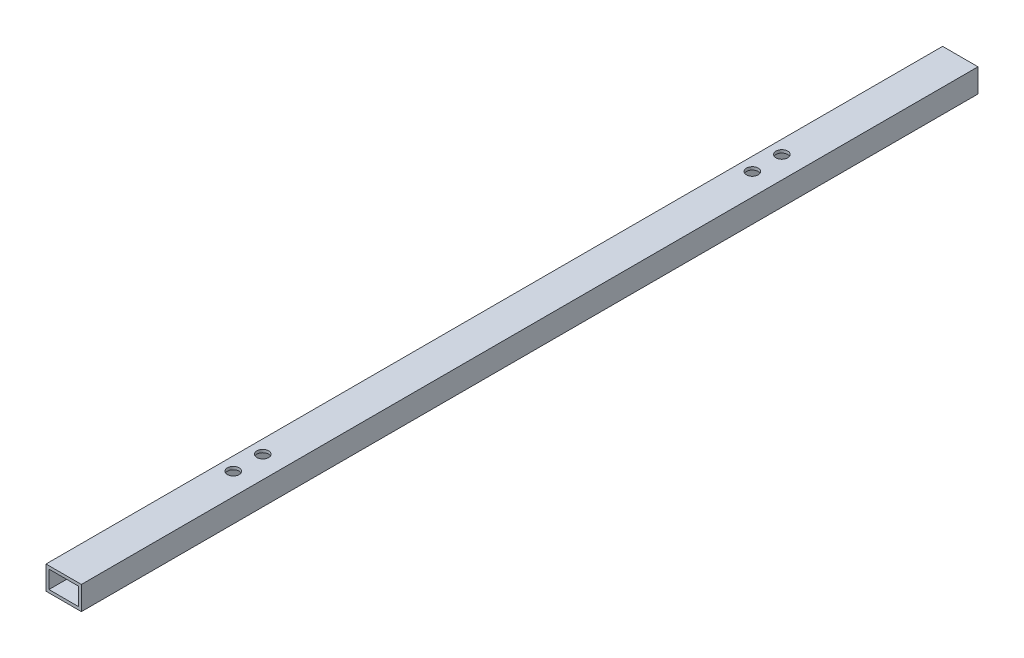
ISO-10303-21;
HEADER;
FILE_DESCRIPTION(('STEP AP214'),'2;1');
FILE_NAME('part.step','',(''),(''),'','','');
FILE_SCHEMA(('AUTOMOTIVE_DESIGN { 1 0 10303 214 1 1 1 1 }'));
ENDSEC;
DATA;
#1=APPLICATION_CONTEXT('core data for automotive mechanical design processes');
#2=APPLICATION_PROTOCOL_DEFINITION('international standard','automotive_design',2000,#1);
#3=PRODUCT_CONTEXT('',#1,'mechanical');
#4=PRODUCT('Part','Part','',(#3));
#5=PRODUCT_RELATED_PRODUCT_CATEGORY('part','',(#4));
#6=PRODUCT_DEFINITION_FORMATION('','',#4);
#7=PRODUCT_DEFINITION_CONTEXT('part definition',#1,'design');
#8=PRODUCT_DEFINITION('design','',#6,#7);
#9=PRODUCT_DEFINITION_SHAPE('','',#8);
#10=(LENGTH_UNIT() NAMED_UNIT(*) SI_UNIT(.MILLI.,.METRE.));
#11=(NAMED_UNIT(*) PLANE_ANGLE_UNIT() SI_UNIT($,.RADIAN.));
#12=(NAMED_UNIT(*) SI_UNIT($,.STERADIAN.) SOLID_ANGLE_UNIT());
#13=UNCERTAINTY_MEASURE_WITH_UNIT(LENGTH_MEASURE(1.E-05),#10,'distance_accuracy_value','');
#14=(GEOMETRIC_REPRESENTATION_CONTEXT(3) GLOBAL_UNCERTAINTY_ASSIGNED_CONTEXT((#13)) GLOBAL_UNIT_ASSIGNED_CONTEXT((#10,
#11,#12)) REPRESENTATION_CONTEXT('',''));
#15=CARTESIAN_POINT('',(0.,0.,0.));
#16=DIRECTION('',(0.,0.,1.));
#17=DIRECTION('',(1.,0.,0.));
#18=AXIS2_PLACEMENT_3D('',#15,#16,#17);
#19=CARTESIAN_POINT('',(19.05,-12.7,482.6));
#20=DIRECTION('',(0.,1.,0.));
#21=DIRECTION('',(0.,0.,1.));
#22=AXIS2_PLACEMENT_3D('',#19,#20,#21);
#23=PLANE('',#22);
#24=CARTESIAN_POINT('',(-4.7625,-12.7,-295.275));
#25=DIRECTION('',(0.,1.,0.));
#26=DIRECTION('',(0.,0.,1.));
#27=AXIS2_PLACEMENT_3D('',#24,#25,#26);
#28=CIRCLE('',#27,6.35);
#29=CARTESIAN_POINT('',(-4.7625,-12.7,-288.925));
#30=VERTEX_POINT('',#29);
#31=EDGE_CURVE('E239',#30,#30,#28,.T.);
#32=ORIENTED_EDGE('',*,*,#31,.T.);
#33=EDGE_LOOP('',(#32));
#34=FACE_BOUND('',#33,.T.);
#35=CARTESIAN_POINT('',(-4.7625,-12.7,263.525));
#36=DIRECTION('',(0.,1.,0.));
#37=DIRECTION('',(0.,0.,1.));
#38=AXIS2_PLACEMENT_3D('',#35,#36,#37);
#39=CIRCLE('',#38,6.34999999999999);
#40=CARTESIAN_POINT('',(-4.7625,-12.7,269.875));
#41=VERTEX_POINT('',#40);
#42=EDGE_CURVE('E205',#41,#41,#39,.T.);
#43=ORIENTED_EDGE('',*,*,#42,.T.);
#44=EDGE_LOOP('',(#43));
#45=FACE_BOUND('',#44,.T.);
#46=DIRECTION('',(0.,0.,-1.));
#47=VECTOR('',#46,1.);
#48=CARTESIAN_POINT('',(-19.05,-12.7,482.6));
#49=LINE('',#48,#47);
#50=CARTESIAN_POINT('',(-19.05,-12.7,482.6));
#51=VERTEX_POINT('',#50);
#52=CARTESIAN_POINT('',(-19.05,-12.7,-482.6));
#53=VERTEX_POINT('',#52);
#54=EDGE_CURVE('E11',#51,#53,#49,.T.);
#55=ORIENTED_EDGE('',*,*,#54,.T.);
#56=DIRECTION('',(1.,0.,0.));
#57=VECTOR('',#56,1.);
#58=CARTESIAN_POINT('',(19.05,-12.7,-482.6));
#59=LINE('',#58,#57);
#60=CARTESIAN_POINT('',(19.05,-12.7,-482.6));
#61=VERTEX_POINT('',#60);
#62=EDGE_CURVE('E152',#53,#61,#59,.T.);
#63=ORIENTED_EDGE('',*,*,#62,.T.);
#64=DIRECTION('',(0.,0.,-1.));
#65=VECTOR('',#64,1.);
#66=CARTESIAN_POINT('',(19.05,-12.7,482.6));
#67=LINE('',#66,#65);
#68=CARTESIAN_POINT('',(19.05,-12.7,482.6));
#69=VERTEX_POINT('',#68);
#70=EDGE_CURVE('E49',#69,#61,#67,.T.);
#71=ORIENTED_EDGE('',*,*,#70,.F.);
#72=DIRECTION('',(1.,0.,0.));
#73=VECTOR('',#72,1.);
#74=CARTESIAN_POINT('',(19.05,-12.7,482.6));
#75=LINE('',#74,#73);
#76=EDGE_CURVE('E184',#51,#69,#75,.T.);
#77=ORIENTED_EDGE('',*,*,#76,.F.);
#78=EDGE_LOOP('',(#55,#63,#71,#77));
#79=FACE_BOUND('',#78,.T.);
#80=CARTESIAN_POINT('',(-4.7625,-12.7,-263.525));
#81=DIRECTION('',(0.,1.,0.));
#82=DIRECTION('',(0.,0.,1.));
#83=AXIS2_PLACEMENT_3D('',#80,#81,#82);
#84=CIRCLE('',#83,6.35);
#85=CARTESIAN_POINT('',(-4.7625,-12.7,-257.175));
#86=VERTEX_POINT('',#85);
#87=EDGE_CURVE('E240',#86,#86,#84,.F.);
#88=ORIENTED_EDGE('',*,*,#87,.F.);
#89=EDGE_LOOP('',(#88));
#90=FACE_BOUND('',#89,.T.);
#91=CARTESIAN_POINT('',(-4.7625,-12.7,295.275));
#92=DIRECTION('',(0.,1.,0.));
#93=DIRECTION('',(0.,0.,1.));
#94=AXIS2_PLACEMENT_3D('',#91,#92,#93);
#95=CIRCLE('',#94,6.34999999999999);
#96=CARTESIAN_POINT('',(-4.7625,-12.7,301.625));
#97=VERTEX_POINT('',#96);
#98=EDGE_CURVE('E231',#97,#97,#95,.F.);
#99=ORIENTED_EDGE('',*,*,#98,.F.);
#100=EDGE_LOOP('',(#99));
#101=FACE_BOUND('',#100,.T.);
#102=ADVANCED_FACE('F39',(#34,#45,#79,#90,#101),#23,.F.);
#103=CARTESIAN_POINT('',(19.05,12.7,482.6));
#104=DIRECTION('',(0.,-1.,0.));
#105=DIRECTION('',(0.,0.,-1.));
#106=AXIS2_PLACEMENT_3D('',#103,#104,#105);
#107=PLANE('',#106);
#108=CARTESIAN_POINT('',(-4.7625,12.7,-295.275));
#109=DIRECTION('',(0.,1.,0.));
#110=DIRECTION('',(0.,0.,1.));
#111=AXIS2_PLACEMENT_3D('',#108,#109,#110);
#112=CIRCLE('',#111,6.35);
#113=CARTESIAN_POINT('',(-4.7625,12.7,-288.925));
#114=VERTEX_POINT('',#113);
#115=EDGE_CURVE('E235',#114,#114,#112,.T.);
#116=ORIENTED_EDGE('',*,*,#115,.F.);
#117=EDGE_LOOP('',(#116));
#118=FACE_BOUND('',#117,.T.);
#119=CARTESIAN_POINT('',(-4.7625,12.7,263.525));
#120=DIRECTION('',(0.,1.,0.));
#121=DIRECTION('',(0.,0.,1.));
#122=AXIS2_PLACEMENT_3D('',#119,#120,#121);
#123=CIRCLE('',#122,6.34999999999999);
#124=CARTESIAN_POINT('',(-4.7625,12.7,269.875));
#125=VERTEX_POINT('',#124);
#126=EDGE_CURVE('E227',#125,#125,#123,.T.);
#127=ORIENTED_EDGE('',*,*,#126,.F.);
#128=EDGE_LOOP('',(#127));
#129=FACE_BOUND('',#128,.T.);
#130=DIRECTION('',(0.,0.,-1.));
#131=VECTOR('',#130,1.);
#132=CARTESIAN_POINT('',(19.05,12.7,482.6));
#133=LINE('',#132,#131);
#134=CARTESIAN_POINT('',(19.05,12.7,482.6));
#135=VERTEX_POINT('',#134);
#136=CARTESIAN_POINT('',(19.05,12.7,-482.6));
#137=VERTEX_POINT('',#136);
#138=EDGE_CURVE('E195',#135,#137,#133,.T.);
#139=ORIENTED_EDGE('',*,*,#138,.T.);
#140=DIRECTION('',(-1.,0.,0.));
#141=VECTOR('',#140,1.);
#142=CARTESIAN_POINT('',(19.05,12.7,-482.6));
#143=LINE('',#142,#141);
#144=CARTESIAN_POINT('',(-19.05,12.7,-482.6));
#145=VERTEX_POINT('',#144);
#146=EDGE_CURVE('E160',#137,#145,#143,.T.);
#147=ORIENTED_EDGE('',*,*,#146,.T.);
#148=DIRECTION('',(0.,0.,-1.));
#149=VECTOR('',#148,1.);
#150=CARTESIAN_POINT('',(-19.05,12.7,482.6));
#151=LINE('',#150,#149);
#152=CARTESIAN_POINT('',(-19.05,12.7,482.6));
#153=VERTEX_POINT('',#152);
#154=EDGE_CURVE('E192',#153,#145,#151,.T.);
#155=ORIENTED_EDGE('',*,*,#154,.F.);
#156=DIRECTION('',(-1.,0.,0.));
#157=VECTOR('',#156,1.);
#158=CARTESIAN_POINT('',(19.05,12.7,482.6));
#159=LINE('',#158,#157);
#160=EDGE_CURVE('E65',#135,#153,#159,.T.);
#161=ORIENTED_EDGE('',*,*,#160,.F.);
#162=EDGE_LOOP('',(#139,#147,#155,#161));
#163=FACE_BOUND('',#162,.T.);
#164=CARTESIAN_POINT('',(-4.7625,12.7,-263.525));
#165=DIRECTION('',(0.,1.,0.));
#166=DIRECTION('',(0.,0.,1.));
#167=AXIS2_PLACEMENT_3D('',#164,#165,#166);
#168=CIRCLE('',#167,6.35);
#169=CARTESIAN_POINT('',(-4.7625,12.7,-257.175));
#170=VERTEX_POINT('',#169);
#171=EDGE_CURVE('E251',#170,#170,#168,.F.);
#172=ORIENTED_EDGE('',*,*,#171,.T.);
#173=EDGE_LOOP('',(#172));
#174=FACE_BOUND('',#173,.T.);
#175=CARTESIAN_POINT('',(-4.7625,12.7,295.275));
#176=DIRECTION('',(0.,1.,0.));
#177=DIRECTION('',(0.,0.,1.));
#178=AXIS2_PLACEMENT_3D('',#175,#176,#177);
#179=CIRCLE('',#178,6.34999999999999);
#180=CARTESIAN_POINT('',(-4.7625,12.7,301.625));
#181=VERTEX_POINT('',#180);
#182=EDGE_CURVE('E244',#181,#181,#179,.F.);
#183=ORIENTED_EDGE('',*,*,#182,.T.);
#184=EDGE_LOOP('',(#183));
#185=FACE_BOUND('',#184,.T.);
#186=ADVANCED_FACE('F263',(#118,#129,#163,#174,#185),#107,.F.);
#187=CARTESIAN_POINT('',(15.875,-9.525,482.6));
#188=DIRECTION('',(0.,1.,0.));
#189=DIRECTION('',(0.,0.,1.));
#190=AXIS2_PLACEMENT_3D('',#187,#188,#189);
#191=PLANE('',#190);
#192=CARTESIAN_POINT('',(-4.7625,-9.525,-263.525));
#193=DIRECTION('',(0.,1.,0.));
#194=DIRECTION('',(0.,0.,1.));
#195=AXIS2_PLACEMENT_3D('',#192,#193,#194);
#196=CIRCLE('',#195,6.35);
#197=CARTESIAN_POINT('',(-4.7625,-9.525,-257.175));
#198=VERTEX_POINT('',#197);
#199=EDGE_CURVE('E209',#198,#198,#196,.F.);
#200=ORIENTED_EDGE('',*,*,#199,.T.);
#201=EDGE_LOOP('',(#200));
#202=FACE_BOUND('',#201,.T.);
#203=CARTESIAN_POINT('',(-4.7625,-9.525,263.525));
#204=DIRECTION('',(0.,1.,0.));
#205=DIRECTION('',(0.,0.,1.));
#206=AXIS2_PLACEMENT_3D('',#203,#204,#205);
#207=CIRCLE('',#206,6.34999999999999);
#208=CARTESIAN_POINT('',(-4.7625,-9.525,269.875));
#209=VERTEX_POINT('',#208);
#210=EDGE_CURVE('E204',#209,#209,#207,.T.);
#211=ORIENTED_EDGE('',*,*,#210,.F.);
#212=EDGE_LOOP('',(#211));
#213=FACE_BOUND('',#212,.T.);
#214=DIRECTION('',(0.,0.,-1.));
#215=VECTOR('',#214,1.);
#216=CARTESIAN_POINT('',(15.875,-9.525,482.6));
#217=LINE('',#216,#215);
#218=CARTESIAN_POINT('',(15.875,-9.525,482.6));
#219=VERTEX_POINT('',#218);
#220=CARTESIAN_POINT('',(15.875,-9.525,-482.6));
#221=VERTEX_POINT('',#220);
#222=EDGE_CURVE('E120',#219,#221,#217,.T.);
#223=ORIENTED_EDGE('',*,*,#222,.T.);
#224=DIRECTION('',(1.,0.,0.));
#225=VECTOR('',#224,1.);
#226=CARTESIAN_POINT('',(15.875,-9.525,-482.6));
#227=LINE('',#226,#225);
#228=CARTESIAN_POINT('',(-15.875,-9.525,-482.6));
#229=VERTEX_POINT('',#228);
#230=EDGE_CURVE('E123',#229,#221,#227,.T.);
#231=ORIENTED_EDGE('',*,*,#230,.F.);
#232=DIRECTION('',(0.,0.,-1.));
#233=VECTOR('',#232,1.);
#234=CARTESIAN_POINT('',(-15.875,-9.525,482.6));
#235=LINE('',#234,#233);
#236=CARTESIAN_POINT('',(-15.875,-9.525,482.6));
#237=VERTEX_POINT('',#236);
#238=EDGE_CURVE('E107',#237,#229,#235,.T.);
#239=ORIENTED_EDGE('',*,*,#238,.F.);
#240=DIRECTION('',(1.,0.,0.));
#241=VECTOR('',#240,1.);
#242=CARTESIAN_POINT('',(15.875,-9.525,482.6));
#243=LINE('',#242,#241);
#244=EDGE_CURVE('E166',#237,#219,#243,.T.);
#245=ORIENTED_EDGE('',*,*,#244,.T.);
#246=EDGE_LOOP('',(#223,#231,#239,#245));
#247=FACE_BOUND('',#246,.T.);
#248=CARTESIAN_POINT('',(-4.7625,-9.525,-295.275));
#249=DIRECTION('',(0.,1.,0.));
#250=DIRECTION('',(0.,0.,1.));
#251=AXIS2_PLACEMENT_3D('',#248,#249,#250);
#252=CIRCLE('',#251,6.35);
#253=CARTESIAN_POINT('',(-4.7625,-9.525,-288.925));
#254=VERTEX_POINT('',#253);
#255=EDGE_CURVE('E213',#254,#254,#252,.T.);
#256=ORIENTED_EDGE('',*,*,#255,.F.);
#257=EDGE_LOOP('',(#256));
#258=FACE_BOUND('',#257,.T.);
#259=CARTESIAN_POINT('',(-4.7625,-9.525,295.275));
#260=DIRECTION('',(0.,1.,0.));
#261=DIRECTION('',(0.,0.,1.));
#262=AXIS2_PLACEMENT_3D('',#259,#260,#261);
#263=CIRCLE('',#262,6.34999999999999);
#264=CARTESIAN_POINT('',(-4.7625,-9.525,301.625));
#265=VERTEX_POINT('',#264);
#266=EDGE_CURVE('E137',#265,#265,#263,.F.);
#267=ORIENTED_EDGE('',*,*,#266,.T.);
#268=EDGE_LOOP('',(#267));
#269=FACE_BOUND('',#268,.T.);
#270=ADVANCED_FACE('F124',(#202,#213,#247,#258,#269),#191,.T.);
#271=CARTESIAN_POINT('',(15.875,9.525,482.6));
#272=DIRECTION('',(0.,-1.,0.));
#273=DIRECTION('',(1.,0.,0.));
#274=AXIS2_PLACEMENT_3D('',#271,#272,#273);
#275=PLANE('',#274);
#276=CARTESIAN_POINT('',(-4.7625,9.525,-263.525));
#277=DIRECTION('',(0.,-1.,0.));
#278=DIRECTION('',(1.,0.,0.));
#279=AXIS2_PLACEMENT_3D('',#276,#277,#278);
#280=CIRCLE('',#279,6.35);
#281=CARTESIAN_POINT('',(1.5875,9.525,-263.525));
#282=VERTEX_POINT('',#281);
#283=EDGE_CURVE('E206',#282,#282,#280,.F.);
#284=ORIENTED_EDGE('',*,*,#283,.T.);
#285=EDGE_LOOP('',(#284));
#286=FACE_BOUND('',#285,.T.);
#287=CARTESIAN_POINT('',(-4.7625,9.525,263.525));
#288=DIRECTION('',(0.,-1.,0.));
#289=DIRECTION('',(1.,0.,0.));
#290=AXIS2_PLACEMENT_3D('',#287,#288,#289);
#291=CIRCLE('',#290,6.34999999999999);
#292=CARTESIAN_POINT('',(1.58749999999999,9.525,263.525));
#293=VERTEX_POINT('',#292);
#294=EDGE_CURVE('E200',#293,#293,#291,.T.);
#295=ORIENTED_EDGE('',*,*,#294,.F.);
#296=EDGE_LOOP('',(#295));
#297=FACE_BOUND('',#296,.T.);
#298=DIRECTION('',(0.,0.,-1.));
#299=VECTOR('',#298,1.);
#300=CARTESIAN_POINT('',(-15.875,9.525,482.6));
#301=LINE('',#300,#299);
#302=CARTESIAN_POINT('',(-15.875,9.525,482.6));
#303=VERTEX_POINT('',#302);
#304=CARTESIAN_POINT('',(-15.875,9.525,-482.6));
#305=VERTEX_POINT('',#304);
#306=EDGE_CURVE('E175',#303,#305,#301,.T.);
#307=ORIENTED_EDGE('',*,*,#306,.T.);
#308=DIRECTION('',(-1.,0.,0.));
#309=VECTOR('',#308,1.);
#310=CARTESIAN_POINT('',(15.875,9.525,-482.6));
#311=LINE('',#310,#309);
#312=CARTESIAN_POINT('',(15.875,9.525,-482.6));
#313=VERTEX_POINT('',#312);
#314=EDGE_CURVE('E135',#313,#305,#311,.T.);
#315=ORIENTED_EDGE('',*,*,#314,.F.);
#316=DIRECTION('',(0.,0.,-1.));
#317=VECTOR('',#316,1.);
#318=CARTESIAN_POINT('',(15.875,9.525,482.6));
#319=LINE('',#318,#317);
#320=CARTESIAN_POINT('',(15.875,9.525,482.6));
#321=VERTEX_POINT('',#320);
#322=EDGE_CURVE('E57',#321,#313,#319,.T.);
#323=ORIENTED_EDGE('',*,*,#322,.F.);
#324=DIRECTION('',(-1.,0.,0.));
#325=VECTOR('',#324,1.);
#326=CARTESIAN_POINT('',(15.875,9.525,482.6));
#327=LINE('',#326,#325);
#328=EDGE_CURVE('E172',#321,#303,#327,.T.);
#329=ORIENTED_EDGE('',*,*,#328,.T.);
#330=EDGE_LOOP('',(#307,#315,#323,#329));
#331=FACE_BOUND('',#330,.T.);
#332=CARTESIAN_POINT('',(-4.7625,9.525,-295.275));
#333=DIRECTION('',(0.,-1.,0.));
#334=DIRECTION('',(1.,0.,0.));
#335=AXIS2_PLACEMENT_3D('',#332,#333,#334);
#336=CIRCLE('',#335,6.35);
#337=CARTESIAN_POINT('',(1.5875,9.525,-295.275));
#338=VERTEX_POINT('',#337);
#339=EDGE_CURVE('E210',#338,#338,#336,.T.);
#340=ORIENTED_EDGE('',*,*,#339,.F.);
#341=EDGE_LOOP('',(#340));
#342=FACE_BOUND('',#341,.T.);
#343=CARTESIAN_POINT('',(-4.7625,9.525,295.275));
#344=DIRECTION('',(0.,-1.,0.));
#345=DIRECTION('',(1.,0.,0.));
#346=AXIS2_PLACEMENT_3D('',#343,#344,#345);
#347=CIRCLE('',#346,6.34999999999999);
#348=CARTESIAN_POINT('',(1.58749999999999,9.525,295.275));
#349=VERTEX_POINT('',#348);
#350=EDGE_CURVE('E43',#349,#349,#347,.F.);
#351=ORIENTED_EDGE('',*,*,#350,.T.);
#352=EDGE_LOOP('',(#351));
#353=FACE_BOUND('',#352,.T.);
#354=ADVANCED_FACE('F303',(#286,#297,#331,#342,#353),#275,.T.);
#355=CARTESIAN_POINT('',(0.,0.,482.6));
#356=DIRECTION('',(0.,0.,1.));
#357=DIRECTION('',(1.,0.,0.));
#358=AXIS2_PLACEMENT_3D('',#355,#356,#357);
#359=PLANE('',#358);
#360=DIRECTION('',(0.,-1.,0.));
#361=VECTOR('',#360,1.);
#362=CARTESIAN_POINT('',(-19.05,-12.7,482.6));
#363=LINE('',#362,#361);
#364=EDGE_CURVE('E119',#153,#51,#363,.T.);
#365=ORIENTED_EDGE('',*,*,#364,.T.);
#366=ORIENTED_EDGE('',*,*,#76,.T.);
#367=DIRECTION('',(0.,1.,0.));
#368=VECTOR('',#367,1.);
#369=CARTESIAN_POINT('',(19.05,-12.7,482.6));
#370=LINE('',#369,#368);
#371=EDGE_CURVE('E187',#69,#135,#370,.T.);
#372=ORIENTED_EDGE('',*,*,#371,.T.);
#373=ORIENTED_EDGE('',*,*,#160,.T.);
#374=EDGE_LOOP('',(#365,#366,#372,#373));
#375=FACE_BOUND('',#374,.T.);
#376=ORIENTED_EDGE('',*,*,#244,.F.);
#377=DIRECTION('',(0.,-1.,0.));
#378=VECTOR('',#377,1.);
#379=CARTESIAN_POINT('',(-15.875,-9.525,482.6));
#380=LINE('',#379,#378);
#381=EDGE_CURVE('E115',#303,#237,#380,.T.);
#382=ORIENTED_EDGE('',*,*,#381,.F.);
#383=ORIENTED_EDGE('',*,*,#328,.F.);
#384=DIRECTION('',(0.,1.,0.));
#385=VECTOR('',#384,1.);
#386=CARTESIAN_POINT('',(15.875,-9.525,482.6));
#387=LINE('',#386,#385);
#388=EDGE_CURVE('E169',#219,#321,#387,.T.);
#389=ORIENTED_EDGE('',*,*,#388,.F.);
#390=EDGE_LOOP('',(#376,#382,#383,#389));
#391=FACE_BOUND('',#390,.T.);
#392=ADVANCED_FACE('F309',(#375,#391),#359,.T.);
#393=CARTESIAN_POINT('',(-19.05,-12.7,482.6));
#394=DIRECTION('',(1.,0.,0.));
#395=DIRECTION('',(0.,0.,-1.));
#396=AXIS2_PLACEMENT_3D('',#393,#394,#395);
#397=PLANE('',#396);
#398=ORIENTED_EDGE('',*,*,#154,.T.);
#399=DIRECTION('',(0.,-1.,0.));
#400=VECTOR('',#399,1.);
#401=CARTESIAN_POINT('',(-19.05,-12.7,-482.6));
#402=LINE('',#401,#400);
#403=EDGE_CURVE('E148',#145,#53,#402,.T.);
#404=ORIENTED_EDGE('',*,*,#403,.T.);
#405=ORIENTED_EDGE('',*,*,#54,.F.);
#406=ORIENTED_EDGE('',*,*,#364,.F.);
#407=EDGE_LOOP('',(#398,#404,#405,#406));
#408=FACE_BOUND('',#407,.T.);
#409=ADVANCED_FACE('F41',(#408),#397,.F.);
#410=CARTESIAN_POINT('',(19.05,-12.7,482.6));
#411=DIRECTION('',(-1.,0.,0.));
#412=DIRECTION('',(0.,-1.,0.));
#413=AXIS2_PLACEMENT_3D('',#410,#411,#412);
#414=PLANE('',#413);
#415=ORIENTED_EDGE('',*,*,#70,.T.);
#416=DIRECTION('',(0.,1.,0.));
#417=VECTOR('',#416,1.);
#418=CARTESIAN_POINT('',(19.05,-12.7,-482.6));
#419=LINE('',#418,#417);
#420=EDGE_CURVE('E156',#61,#137,#419,.T.);
#421=ORIENTED_EDGE('',*,*,#420,.T.);
#422=ORIENTED_EDGE('',*,*,#138,.F.);
#423=ORIENTED_EDGE('',*,*,#371,.F.);
#424=EDGE_LOOP('',(#415,#421,#422,#423));
#425=FACE_BOUND('',#424,.T.);
#426=ADVANCED_FACE('F311',(#425),#414,.F.);
#427=CARTESIAN_POINT('',(-15.875,-9.525,482.6));
#428=DIRECTION('',(1.,0.,0.));
#429=DIRECTION('',(0.,0.,-1.));
#430=AXIS2_PLACEMENT_3D('',#427,#428,#429);
#431=PLANE('',#430);
#432=ORIENTED_EDGE('',*,*,#238,.T.);
#433=DIRECTION('',(0.,-1.,0.));
#434=VECTOR('',#433,1.);
#435=CARTESIAN_POINT('',(-15.875,-9.525,-482.6));
#436=LINE('',#435,#434);
#437=EDGE_CURVE('E112',#305,#229,#436,.T.);
#438=ORIENTED_EDGE('',*,*,#437,.F.);
#439=ORIENTED_EDGE('',*,*,#306,.F.);
#440=ORIENTED_EDGE('',*,*,#381,.T.);
#441=EDGE_LOOP('',(#432,#438,#439,#440));
#442=FACE_BOUND('',#441,.T.);
#443=ADVANCED_FACE('F109',(#442),#431,.T.);
#444=CARTESIAN_POINT('',(15.875,-9.525,482.6));
#445=DIRECTION('',(-1.,0.,0.));
#446=DIRECTION('',(0.,0.,1.));
#447=AXIS2_PLACEMENT_3D('',#444,#445,#446);
#448=PLANE('',#447);
#449=ORIENTED_EDGE('',*,*,#322,.T.);
#450=DIRECTION('',(0.,1.,0.));
#451=VECTOR('',#450,1.);
#452=CARTESIAN_POINT('',(15.875,-9.525,-482.6));
#453=LINE('',#452,#451);
#454=EDGE_CURVE('E131',#221,#313,#453,.T.);
#455=ORIENTED_EDGE('',*,*,#454,.F.);
#456=ORIENTED_EDGE('',*,*,#222,.F.);
#457=ORIENTED_EDGE('',*,*,#388,.T.);
#458=EDGE_LOOP('',(#449,#455,#456,#457));
#459=FACE_BOUND('',#458,.T.);
#460=ADVANCED_FACE('F318',(#459),#448,.T.);
#461=CARTESIAN_POINT('',(0.,0.,-482.6));
#462=DIRECTION('',(0.,0.,1.));
#463=DIRECTION('',(1.,0.,0.));
#464=AXIS2_PLACEMENT_3D('',#461,#462,#463);
#465=PLANE('',#464);
#466=ORIENTED_EDGE('',*,*,#314,.T.);
#467=ORIENTED_EDGE('',*,*,#437,.T.);
#468=ORIENTED_EDGE('',*,*,#230,.T.);
#469=ORIENTED_EDGE('',*,*,#454,.T.);
#470=EDGE_LOOP('',(#466,#467,#468,#469));
#471=FACE_BOUND('',#470,.T.);
#472=ORIENTED_EDGE('',*,*,#403,.F.);
#473=ORIENTED_EDGE('',*,*,#146,.F.);
#474=ORIENTED_EDGE('',*,*,#420,.F.);
#475=ORIENTED_EDGE('',*,*,#62,.F.);
#476=EDGE_LOOP('',(#472,#473,#474,#475));
#477=FACE_BOUND('',#476,.T.);
#478=ADVANCED_FACE('F133',(#471,#477),#465,.F.);
#479=CARTESIAN_POINT('',(-4.7625,-12.7,263.525));
#480=DIRECTION('',(0.,1.,0.));
#481=DIRECTION('',(0.,0.,1.));
#482=AXIS2_PLACEMENT_3D('',#479,#480,#481);
#483=CYLINDRICAL_SURFACE('',#482,6.34999999999999);
#484=ORIENTED_EDGE('',*,*,#294,.T.);
#485=EDGE_LOOP('',(#484));
#486=FACE_BOUND('',#485,.T.);
#487=ORIENTED_EDGE('',*,*,#126,.T.);
#488=EDGE_LOOP('',(#487));
#489=FACE_BOUND('',#488,.T.);
#490=ADVANCED_FACE('F290',(#486,#489),#483,.F.);
#491=CARTESIAN_POINT('',(-4.7625,-12.7,-263.525));
#492=DIRECTION('',(0.,1.,0.));
#493=DIRECTION('',(0.,0.,1.));
#494=AXIS2_PLACEMENT_3D('',#491,#492,#493);
#495=CYLINDRICAL_SURFACE('',#494,6.35);
#496=ORIENTED_EDGE('',*,*,#283,.F.);
#497=EDGE_LOOP('',(#496));
#498=FACE_BOUND('',#497,.T.);
#499=ORIENTED_EDGE('',*,*,#171,.F.);
#500=EDGE_LOOP('',(#499));
#501=FACE_BOUND('',#500,.T.);
#502=ADVANCED_FACE('F291',(#498,#501),#495,.F.);
#503=CARTESIAN_POINT('',(-4.7625,-12.7,-295.275));
#504=DIRECTION('',(0.,1.,0.));
#505=DIRECTION('',(0.,0.,1.));
#506=AXIS2_PLACEMENT_3D('',#503,#504,#505);
#507=CYLINDRICAL_SURFACE('',#506,6.35);
#508=ORIENTED_EDGE('',*,*,#339,.T.);
#509=EDGE_LOOP('',(#508));
#510=FACE_BOUND('',#509,.T.);
#511=ORIENTED_EDGE('',*,*,#115,.T.);
#512=EDGE_LOOP('',(#511));
#513=FACE_BOUND('',#512,.T.);
#514=ADVANCED_FACE('F278',(#510,#513),#507,.F.);
#515=CARTESIAN_POINT('',(-4.7625,-12.7,295.275));
#516=DIRECTION('',(0.,1.,0.));
#517=DIRECTION('',(0.,0.,1.));
#518=AXIS2_PLACEMENT_3D('',#515,#516,#517);
#519=CYLINDRICAL_SURFACE('',#518,6.34999999999999);
#520=ORIENTED_EDGE('',*,*,#350,.F.);
#521=EDGE_LOOP('',(#520));
#522=FACE_BOUND('',#521,.T.);
#523=ORIENTED_EDGE('',*,*,#182,.F.);
#524=EDGE_LOOP('',(#523));
#525=FACE_BOUND('',#524,.T.);
#526=ADVANCED_FACE('F272',(#522,#525),#519,.F.);
#527=ORIENTED_EDGE('',*,*,#210,.T.);
#528=EDGE_LOOP('',(#527));
#529=FACE_BOUND('',#528,.T.);
#530=ORIENTED_EDGE('',*,*,#42,.F.);
#531=EDGE_LOOP('',(#530));
#532=FACE_BOUND('',#531,.T.);
#533=ADVANCED_FACE('F282',(#529,#532),#483,.F.);
#534=ORIENTED_EDGE('',*,*,#199,.F.);
#535=EDGE_LOOP('',(#534));
#536=FACE_BOUND('',#535,.T.);
#537=ORIENTED_EDGE('',*,*,#87,.T.);
#538=EDGE_LOOP('',(#537));
#539=FACE_BOUND('',#538,.T.);
#540=ADVANCED_FACE('F259',(#536,#539),#495,.F.);
#541=ORIENTED_EDGE('',*,*,#255,.T.);
#542=EDGE_LOOP('',(#541));
#543=FACE_BOUND('',#542,.T.);
#544=ORIENTED_EDGE('',*,*,#31,.F.);
#545=EDGE_LOOP('',(#544));
#546=FACE_BOUND('',#545,.T.);
#547=ADVANCED_FACE('F269',(#543,#546),#507,.F.);
#548=ORIENTED_EDGE('',*,*,#266,.F.);
#549=EDGE_LOOP('',(#548));
#550=FACE_BOUND('',#549,.T.);
#551=ORIENTED_EDGE('',*,*,#98,.T.);
#552=EDGE_LOOP('',(#551));
#553=FACE_BOUND('',#552,.T.);
#554=ADVANCED_FACE('F267',(#550,#553),#519,.F.);
#555=CLOSED_SHELL('',(#102,#186,#270,#354,#392,#409,#426,#443,#460,#478,#490,#502,#514,#526,
#533,#540,#547,#554));
#556=MANIFOLD_SOLID_BREP('B2',#555);
#557=ADVANCED_BREP_SHAPE_REPRESENTATION('',(#18,#556),#14);
#558=SHAPE_DEFINITION_REPRESENTATION(#9,#557);
ENDSEC;
END-ISO-10303-21;
